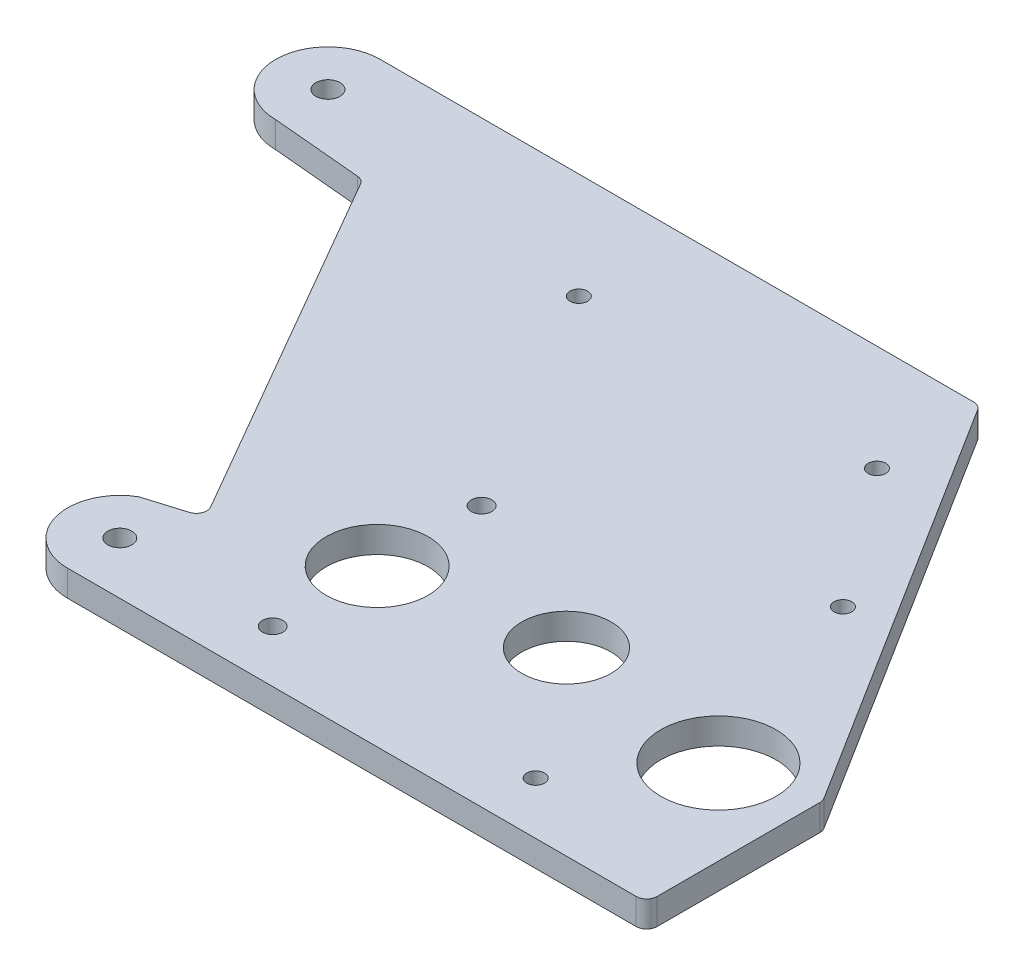
ISO-10303-21;
HEADER;
FILE_DESCRIPTION(('STEP AP214'),'2;1');
FILE_NAME('part.step','',(''),(''),'','','');
FILE_SCHEMA(('AUTOMOTIVE_DESIGN { 1 0 10303 214 1 1 1 1 }'));
ENDSEC;
DATA;
#1=APPLICATION_CONTEXT('core data for automotive mechanical design processes');
#2=APPLICATION_PROTOCOL_DEFINITION('international standard','automotive_design',2000,#1);
#3=PRODUCT_CONTEXT('',#1,'mechanical');
#4=PRODUCT('Part','Part','',(#3));
#5=PRODUCT_RELATED_PRODUCT_CATEGORY('part','',(#4));
#6=PRODUCT_DEFINITION_FORMATION('','',#4);
#7=PRODUCT_DEFINITION_CONTEXT('part definition',#1,'design');
#8=PRODUCT_DEFINITION('design','',#6,#7);
#9=PRODUCT_DEFINITION_SHAPE('','',#8);
#10=(LENGTH_UNIT() NAMED_UNIT(*) SI_UNIT(.MILLI.,.METRE.));
#11=(NAMED_UNIT(*) PLANE_ANGLE_UNIT() SI_UNIT($,.RADIAN.));
#12=(NAMED_UNIT(*) SI_UNIT($,.STERADIAN.) SOLID_ANGLE_UNIT());
#13=UNCERTAINTY_MEASURE_WITH_UNIT(LENGTH_MEASURE(1.E-05),#10,'distance_accuracy_value','');
#14=(GEOMETRIC_REPRESENTATION_CONTEXT(3) GLOBAL_UNCERTAINTY_ASSIGNED_CONTEXT((#13)) GLOBAL_UNIT_ASSIGNED_CONTEXT((#10,
#11,#12)) REPRESENTATION_CONTEXT('',''));
#15=CARTESIAN_POINT('',(0.,0.,0.));
#16=DIRECTION('',(0.,0.,1.));
#17=DIRECTION('',(1.,0.,0.));
#18=AXIS2_PLACEMENT_3D('',#15,#16,#17);
#19=CARTESIAN_POINT('',(4.63150989898809,6.35,15.2100282546713));
#20=DIRECTION('',(-0.291298086746579,0.,-0.956632335151694));
#21=DIRECTION('',(-0.956632335151694,0.,0.291298086746579));
#22=AXIS2_PLACEMENT_3D('',#19,#20,#21);
#23=PLANE('',#22);
#24=DIRECTION('',(0.956632335151694,0.,-0.291298086746579));
#25=VECTOR('',#24,1.);
#26=CARTESIAN_POINT('',(4.63150989898809,6.35,15.2100282546713));
#27=LINE('',#26,#25);
#28=CARTESIAN_POINT('',(-105.982617669633,6.35,48.8924395049369));
#29=VERTEX_POINT('',#28);
#30=CARTESIAN_POINT('',(-96.5688292217659,6.35,46.0259060801956));
#31=VERTEX_POINT('',#30);
#32=EDGE_CURVE('E199',#29,#31,#27,.T.);
#33=ORIENTED_EDGE('',*,*,#32,.T.);
#34=DIRECTION('',(0.,-1.,0.));
#35=VECTOR('',#34,1.);
#36=CARTESIAN_POINT('',(-96.5688292217659,6.35,46.0259060801956));
#37=LINE('',#36,#35);
#38=CARTESIAN_POINT('',(-96.5688292217659,0.,46.0259060801956));
#39=VERTEX_POINT('',#38);
#40=EDGE_CURVE('E308',#31,#39,#37,.T.);
#41=ORIENTED_EDGE('',*,*,#40,.T.);
#42=DIRECTION('',(0.956632335151694,0.,-0.291298086746579));
#43=VECTOR('',#42,1.);
#44=CARTESIAN_POINT('',(4.63150989898809,0.,15.2100282546713));
#45=LINE('',#44,#43);
#46=CARTESIAN_POINT('',(-105.982617669633,0.,48.8924395049369));
#47=VERTEX_POINT('',#46);
#48=EDGE_CURVE('E202',#47,#39,#45,.T.);
#49=ORIENTED_EDGE('',*,*,#48,.F.);
#50=DIRECTION('',(0.,-1.,0.));
#51=VECTOR('',#50,1.);
#52=CARTESIAN_POINT('',(-105.982617669633,6.35,48.8924395049369));
#53=LINE('',#52,#51);
#54=EDGE_CURVE('E195',#29,#47,#53,.T.);
#55=ORIENTED_EDGE('',*,*,#54,.F.);
#56=EDGE_LOOP('',(#33,#41,#49,#55));
#57=FACE_BOUND('',#56,.T.);
#58=ADVANCED_FACE('F91',(#57),#23,.T.);
#59=CARTESIAN_POINT('',(-99.6326176696326,6.35,59.8909621329995));
#60=DIRECTION('',(0.,-1.,0.));
#61=DIRECTION('',(0.,0.,-1.));
#62=AXIS2_PLACEMENT_3D('',#59,#60,#61);
#63=CYLINDRICAL_SURFACE('',#62,12.6999999999998);
#64=CARTESIAN_POINT('',(-99.6326176696326,0.,59.8909621329995));
#65=DIRECTION('',(0.,1.,0.));
#66=DIRECTION('',(0.,0.,1.));
#67=AXIS2_PLACEMENT_3D('',#64,#65,#66);
#68=CIRCLE('',#67,12.6999999999998);
#69=CARTESIAN_POINT('',(-99.6326176696326,0.,72.5909621329996));
#70=VERTEX_POINT('',#69);
#71=EDGE_CURVE('E264',#47,#70,#68,.T.);
#72=ORIENTED_EDGE('',*,*,#71,.T.);
#73=DIRECTION('',(0.,-1.,0.));
#74=VECTOR('',#73,1.);
#75=CARTESIAN_POINT('',(-99.6326176696326,6.35,72.5909621329996));
#76=LINE('',#75,#74);
#77=CARTESIAN_POINT('',(-99.6326176696326,6.35,72.5909621329996));
#78=VERTEX_POINT('',#77);
#79=EDGE_CURVE('E207',#78,#70,#76,.T.);
#80=ORIENTED_EDGE('',*,*,#79,.F.);
#81=CARTESIAN_POINT('',(-99.6326176696326,6.35,59.8909621329995));
#82=DIRECTION('',(0.,1.,0.));
#83=DIRECTION('',(0.,0.,1.));
#84=AXIS2_PLACEMENT_3D('',#81,#82,#83);
#85=CIRCLE('',#84,12.6999999999998);
#86=EDGE_CURVE('E211',#29,#78,#85,.T.);
#87=ORIENTED_EDGE('',*,*,#86,.F.);
#88=ORIENTED_EDGE('',*,*,#54,.T.);
#89=EDGE_LOOP('',(#72,#80,#87,#88));
#90=FACE_BOUND('',#89,.T.);
#91=ADVANCED_FACE('F212',(#90),#63,.T.);
#92=CARTESIAN_POINT('',(0.,6.35,72.590962133));
#93=DIRECTION('',(0.,0.,-1.));
#94=DIRECTION('',(-1.,0.,0.));
#95=AXIS2_PLACEMENT_3D('',#92,#93,#94);
#96=PLANE('',#95);
#97=DIRECTION('',(1.,0.,0.));
#98=VECTOR('',#97,1.);
#99=CARTESIAN_POINT('',(0.,0.,72.590962133));
#100=LINE('',#99,#98);
#101=CARTESIAN_POINT('',(38.6744535100556,0.,72.590962133));
#102=VERTEX_POINT('',#101);
#103=EDGE_CURVE('E266',#70,#102,#100,.T.);
#104=ORIENTED_EDGE('',*,*,#103,.T.);
#105=DIRECTION('',(0.,1.,0.));
#106=VECTOR('',#105,1.);
#107=CARTESIAN_POINT('',(38.6744535100556,6.35,72.590962133));
#108=LINE('',#107,#106);
#109=CARTESIAN_POINT('',(38.6744535100556,6.35,72.590962133));
#110=VERTEX_POINT('',#109);
#111=EDGE_CURVE('E310',#102,#110,#108,.T.);
#112=ORIENTED_EDGE('',*,*,#111,.T.);
#113=DIRECTION('',(1.,0.,0.));
#114=VECTOR('',#113,1.);
#115=CARTESIAN_POINT('',(0.,6.35,72.590962133));
#116=LINE('',#115,#114);
#117=EDGE_CURVE('E216',#78,#110,#116,.T.);
#118=ORIENTED_EDGE('',*,*,#117,.F.);
#119=ORIENTED_EDGE('',*,*,#79,.T.);
#120=EDGE_LOOP('',(#104,#112,#118,#119));
#121=FACE_BOUND('',#120,.T.);
#122=ADVANCED_FACE('F369',(#121),#96,.F.);
#123=CARTESIAN_POINT('',(0.,6.35,-72.590962133));
#124=DIRECTION('',(0.,0.,-1.));
#125=DIRECTION('',(-1.,0.,0.));
#126=AXIS2_PLACEMENT_3D('',#123,#124,#125);
#127=PLANE('',#126);
#128=DIRECTION('',(1.,0.,0.));
#129=VECTOR('',#128,1.);
#130=CARTESIAN_POINT('',(0.,6.35,-72.590962133));
#131=LINE('',#130,#129);
#132=CARTESIAN_POINT('',(-168.788743888658,6.35,-72.5909621329999));
#133=VERTEX_POINT('',#132);
#134=CARTESIAN_POINT('',(-24.439230150475,6.35,-72.590962133));
#135=VERTEX_POINT('',#134);
#136=EDGE_CURVE('E230',#133,#135,#131,.T.);
#137=ORIENTED_EDGE('',*,*,#136,.T.);
#138=DIRECTION('',(0.,1.,0.));
#139=VECTOR('',#138,1.);
#140=CARTESIAN_POINT('',(-24.439230150475,0.,-72.590962133));
#141=LINE('',#140,#139);
#142=CARTESIAN_POINT('',(-24.439230150475,0.,-72.590962133));
#143=VERTEX_POINT('',#142);
#144=EDGE_CURVE('E106',#135,#143,#141,.F.);
#145=ORIENTED_EDGE('',*,*,#144,.T.);
#146=DIRECTION('',(1.,0.,0.));
#147=VECTOR('',#146,1.);
#148=CARTESIAN_POINT('',(0.,0.,-72.590962133));
#149=LINE('',#148,#147);
#150=CARTESIAN_POINT('',(-168.788743888658,0.,-72.5909621329999));
#151=VERTEX_POINT('',#150);
#152=EDGE_CURVE('E269',#151,#143,#149,.T.);
#153=ORIENTED_EDGE('',*,*,#152,.F.);
#154=DIRECTION('',(0.,-1.,0.));
#155=VECTOR('',#154,1.);
#156=CARTESIAN_POINT('',(-168.788743888658,6.35,-72.5909621329999));
#157=LINE('',#156,#155);
#158=EDGE_CURVE('E299',#133,#151,#157,.T.);
#159=ORIENTED_EDGE('',*,*,#158,.F.);
#160=EDGE_LOOP('',(#137,#145,#153,#159));
#161=FACE_BOUND('',#160,.T.);
#162=ADVANCED_FACE('F430',(#161),#127,.T.);
#163=CARTESIAN_POINT('',(-168.788743888658,6.35,-59.890962133));
#164=DIRECTION('',(0.,-1.,0.));
#165=DIRECTION('',(0.,0.,-1.));
#166=AXIS2_PLACEMENT_3D('',#163,#164,#165);
#167=CYLINDRICAL_SURFACE('',#166,12.6999999999998);
#168=CARTESIAN_POINT('',(-168.788743888658,0.,-59.890962133));
#169=DIRECTION('',(0.,1.,0.));
#170=DIRECTION('',(0.,0.,1.));
#171=AXIS2_PLACEMENT_3D('',#168,#169,#170);
#172=CIRCLE('',#171,12.6999999999998);
#173=CARTESIAN_POINT('',(-168.788743865942,0.,-47.1909621330002));
#174=VERTEX_POINT('',#173);
#175=EDGE_CURVE('E271',#151,#174,#172,.T.);
#176=ORIENTED_EDGE('',*,*,#175,.T.);
#177=DIRECTION('',(0.,-1.,0.));
#178=VECTOR('',#177,1.);
#179=CARTESIAN_POINT('',(-168.788743865942,6.35,-47.1909621330002));
#180=LINE('',#179,#178);
#181=CARTESIAN_POINT('',(-168.788743865942,6.35,-47.1909621330002));
#182=VERTEX_POINT('',#181);
#183=EDGE_CURVE('E258',#182,#174,#180,.T.);
#184=ORIENTED_EDGE('',*,*,#183,.F.);
#185=CARTESIAN_POINT('',(-168.788743888658,6.35,-59.890962133));
#186=DIRECTION('',(0.,1.,0.));
#187=DIRECTION('',(0.,0.,1.));
#188=AXIS2_PLACEMENT_3D('',#185,#186,#187);
#189=CIRCLE('',#188,12.6999999999998);
#190=EDGE_CURVE('E232',#133,#182,#189,.T.);
#191=ORIENTED_EDGE('',*,*,#190,.F.);
#192=ORIENTED_EDGE('',*,*,#158,.T.);
#193=EDGE_LOOP('',(#176,#184,#191,#192));
#194=FACE_BOUND('',#193,.T.);
#195=ADVANCED_FACE('F426',(#194),#167,.T.);
#196=CARTESIAN_POINT('',(2.86216329422664,6.35,-31.6858333990644));
#197=DIRECTION('',(0.0899631534478357,0.,-0.995945094381071));
#198=DIRECTION('',(-0.995945094381071,0.,-0.0899631534478357));
#199=AXIS2_PLACEMENT_3D('',#196,#197,#198);
#200=PLANE('',#199);
#201=DIRECTION('',(0.995945094381071,0.,0.0899631534478357));
#202=VECTOR('',#201,1.);
#203=CARTESIAN_POINT('',(2.86216329422664,0.,-31.6858333990644));
#204=LINE('',#203,#202);
#205=CARTESIAN_POINT('',(-146.893746505368,0.,-45.2131994848361));
#206=VERTEX_POINT('',#205);
#207=EDGE_CURVE('E274',#174,#206,#204,.T.);
#208=ORIENTED_EDGE('',*,*,#207,.T.);
#209=DIRECTION('',(0.,-1.,0.));
#210=VECTOR('',#209,1.);
#211=CARTESIAN_POINT('',(-146.893746505368,6.35,-45.2131994848361));
#212=LINE('',#211,#210);
#213=CARTESIAN_POINT('',(-146.893746505368,6.35,-45.2131994848361));
#214=VERTEX_POINT('',#213);
#215=EDGE_CURVE('E306',#206,#214,#212,.F.);
#216=ORIENTED_EDGE('',*,*,#215,.T.);
#217=DIRECTION('',(0.995945094381071,0.,0.0899631534478357));
#218=VECTOR('',#217,1.);
#219=CARTESIAN_POINT('',(2.86216329422664,6.35,-31.6858333990644));
#220=LINE('',#219,#218);
#221=EDGE_CURVE('E235',#182,#214,#220,.T.);
#222=ORIENTED_EDGE('',*,*,#221,.F.);
#223=ORIENTED_EDGE('',*,*,#183,.T.);
#224=EDGE_LOOP('',(#208,#216,#222,#223));
#225=FACE_BOUND('',#224,.T.);
#226=ADVANCED_FACE('F408',(#225),#200,.F.);
#227=CARTESIAN_POINT('',(-168.788743888658,6.35,-59.890962133));
#228=DIRECTION('',(0.,-1.,0.));
#229=DIRECTION('',(0.,0.,-1.));
#230=AXIS2_PLACEMENT_3D('',#227,#228,#229);
#231=CYLINDRICAL_SURFACE('',#230,2.92100000000008);
#232=CARTESIAN_POINT('',(-168.788743888658,6.35,-59.890962133));
#233=DIRECTION('',(0.,1.,0.));
#234=DIRECTION('',(0.,0.,1.));
#235=AXIS2_PLACEMENT_3D('',#232,#233,#234);
#236=CIRCLE('',#235,2.92100000000008);
#237=CARTESIAN_POINT('',(-168.788743888658,6.35,-56.9699621329999));
#238=VERTEX_POINT('',#237);
#239=EDGE_CURVE('E252',#238,#238,#236,.T.);
#240=ORIENTED_EDGE('',*,*,#239,.T.);
#241=EDGE_LOOP('',(#240));
#242=FACE_BOUND('',#241,.T.);
#243=CARTESIAN_POINT('',(-168.788743888658,0.,-59.890962133));
#244=DIRECTION('',(0.,1.,0.));
#245=DIRECTION('',(0.,0.,1.));
#246=AXIS2_PLACEMENT_3D('',#243,#244,#245);
#247=CIRCLE('',#246,2.92100000000008);
#248=CARTESIAN_POINT('',(-168.788743888658,0.,-56.9699621329999));
#249=VERTEX_POINT('',#248);
#250=EDGE_CURVE('E292',#249,#249,#247,.T.);
#251=ORIENTED_EDGE('',*,*,#250,.F.);
#252=EDGE_LOOP('',(#251));
#253=FACE_BOUND('',#252,.T.);
#254=ADVANCED_FACE('F404',(#242,#253),#231,.F.);
#255=CARTESIAN_POINT('',(-62.4429464899444,6.35,34.490962133));
#256=DIRECTION('',(0.,-1.,0.));
#257=DIRECTION('',(0.,0.,-1.));
#258=AXIS2_PLACEMENT_3D('',#255,#256,#257);
#259=CYLINDRICAL_SURFACE('',#258,12.3825);
#260=CARTESIAN_POINT('',(-62.4429464899444,6.35,34.490962133));
#261=DIRECTION('',(0.,1.,0.));
#262=DIRECTION('',(0.,0.,1.));
#263=AXIS2_PLACEMENT_3D('',#260,#261,#262);
#264=CIRCLE('',#263,12.3825);
#265=CARTESIAN_POINT('',(-62.4429464899444,6.35,46.873462133));
#266=VERTEX_POINT('',#265);
#267=EDGE_CURVE('E249',#266,#266,#264,.T.);
#268=ORIENTED_EDGE('',*,*,#267,.T.);
#269=EDGE_LOOP('',(#268));
#270=FACE_BOUND('',#269,.T.);
#271=CARTESIAN_POINT('',(-62.4429464899444,0.,34.490962133));
#272=DIRECTION('',(0.,1.,0.));
#273=DIRECTION('',(0.,0.,1.));
#274=AXIS2_PLACEMENT_3D('',#271,#272,#273);
#275=CIRCLE('',#274,12.3825);
#276=CARTESIAN_POINT('',(-62.4429464899444,0.,46.873462133));
#277=VERTEX_POINT('',#276);
#278=EDGE_CURVE('E289',#277,#277,#275,.T.);
#279=ORIENTED_EDGE('',*,*,#278,.F.);
#280=EDGE_LOOP('',(#279));
#281=FACE_BOUND('',#280,.T.);
#282=ADVANCED_FACE('F407',(#270,#281),#259,.F.);
#283=CARTESIAN_POINT('',(-62.4429464899444,6.35,9.09096213299999));
#284=DIRECTION('',(0.,-1.,0.));
#285=DIRECTION('',(0.,0.,-1.));
#286=AXIS2_PLACEMENT_3D('',#283,#284,#285);
#287=CYLINDRICAL_SURFACE('',#286,2.4892);
#288=CARTESIAN_POINT('',(-62.4429464899444,6.35,9.09096213299999));
#289=DIRECTION('',(0.,1.,0.));
#290=DIRECTION('',(0.,0.,1.));
#291=AXIS2_PLACEMENT_3D('',#288,#289,#290);
#292=CIRCLE('',#291,2.4892);
#293=CARTESIAN_POINT('',(-62.4429464899444,6.35,11.580162133));
#294=VERTEX_POINT('',#293);
#295=EDGE_CURVE('E246',#294,#294,#292,.T.);
#296=ORIENTED_EDGE('',*,*,#295,.T.);
#297=EDGE_LOOP('',(#296));
#298=FACE_BOUND('',#297,.T.);
#299=CARTESIAN_POINT('',(-62.4429464899444,0.,9.09096213299999));
#300=DIRECTION('',(0.,1.,0.));
#301=DIRECTION('',(0.,0.,1.));
#302=AXIS2_PLACEMENT_3D('',#299,#300,#301);
#303=CIRCLE('',#302,2.4892);
#304=CARTESIAN_POINT('',(-62.4429464899444,0.,11.580162133));
#305=VERTEX_POINT('',#304);
#306=EDGE_CURVE('E286',#305,#305,#303,.T.);
#307=ORIENTED_EDGE('',*,*,#306,.F.);
#308=EDGE_LOOP('',(#307));
#309=FACE_BOUND('',#308,.T.);
#310=ADVANCED_FACE('F412',(#298,#309),#287,.F.);
#311=CARTESIAN_POINT('',(-62.4429464899444,6.35,59.890962133));
#312=DIRECTION('',(0.,-1.,0.));
#313=DIRECTION('',(0.,0.,-1.));
#314=AXIS2_PLACEMENT_3D('',#311,#312,#313);
#315=CYLINDRICAL_SURFACE('',#314,2.4892);
#316=CARTESIAN_POINT('',(-62.4429464899444,6.35,59.890962133));
#317=DIRECTION('',(0.,1.,0.));
#318=DIRECTION('',(0.,0.,1.));
#319=AXIS2_PLACEMENT_3D('',#316,#317,#318);
#320=CIRCLE('',#319,2.4892);
#321=CARTESIAN_POINT('',(-62.4429464899444,6.35,62.380162133));
#322=VERTEX_POINT('',#321);
#323=EDGE_CURVE('E243',#322,#322,#320,.T.);
#324=ORIENTED_EDGE('',*,*,#323,.T.);
#325=EDGE_LOOP('',(#324));
#326=FACE_BOUND('',#325,.T.);
#327=CARTESIAN_POINT('',(-62.4429464899444,0.,59.890962133));
#328=DIRECTION('',(0.,1.,0.));
#329=DIRECTION('',(0.,0.,1.));
#330=AXIS2_PLACEMENT_3D('',#327,#328,#329);
#331=CIRCLE('',#330,2.4892);
#332=CARTESIAN_POINT('',(-62.4429464899444,0.,62.380162133));
#333=VERTEX_POINT('',#332);
#334=EDGE_CURVE('E283',#333,#333,#331,.T.);
#335=ORIENTED_EDGE('',*,*,#334,.F.);
#336=EDGE_LOOP('',(#335));
#337=FACE_BOUND('',#336,.T.);
#338=ADVANCED_FACE('F416',(#326,#337),#315,.F.);
#339=CARTESIAN_POINT('',(20.5642535100556,6.35,34.490962133));
#340=DIRECTION('',(0.,-1.,0.));
#341=DIRECTION('',(0.,0.,-1.));
#342=AXIS2_PLACEMENT_3D('',#339,#340,#341);
#343=CYLINDRICAL_SURFACE('',#342,14.0335);
#344=CARTESIAN_POINT('',(20.5642535100556,6.35,34.490962133));
#345=DIRECTION('',(0.,1.,0.));
#346=DIRECTION('',(0.,0.,1.));
#347=AXIS2_PLACEMENT_3D('',#344,#345,#346);
#348=CIRCLE('',#347,14.0335);
#349=CARTESIAN_POINT('',(20.5642535100556,6.35,48.524462133));
#350=VERTEX_POINT('',#349);
#351=EDGE_CURVE('E240',#350,#350,#348,.T.);
#352=ORIENTED_EDGE('',*,*,#351,.T.);
#353=EDGE_LOOP('',(#352));
#354=FACE_BOUND('',#353,.T.);
#355=CARTESIAN_POINT('',(20.5642535100556,0.,34.490962133));
#356=DIRECTION('',(0.,1.,0.));
#357=DIRECTION('',(0.,0.,1.));
#358=AXIS2_PLACEMENT_3D('',#355,#356,#357);
#359=CIRCLE('',#358,14.0335);
#360=CARTESIAN_POINT('',(20.5642535100556,0.,48.524462133));
#361=VERTEX_POINT('',#360);
#362=EDGE_CURVE('E280',#361,#361,#359,.T.);
#363=ORIENTED_EDGE('',*,*,#362,.F.);
#364=EDGE_LOOP('',(#363));
#365=FACE_BOUND('',#364,.T.);
#366=ADVANCED_FACE('F383',(#354,#365),#343,.F.);
#367=CARTESIAN_POINT('',(-89.6594879562971,6.35,51.7649295069719));
#368=DIRECTION('',(0.86602540378444,0.,-0.499999999999998));
#369=DIRECTION('',(-0.499999999999998,0.,-0.86602540378444));
#370=AXIS2_PLACEMENT_3D('',#367,#368,#369);
#371=PLANE('',#370);
#372=DIRECTION('',(0.499999999999998,0.,0.86602540378444));
#373=VECTOR('',#372,1.);
#374=CARTESIAN_POINT('',(-89.6594879562971,6.35,51.7649295069719));
#375=LINE('',#374,#373);
#376=CARTESIAN_POINT('',(-144.922548389513,6.35,-43.9534989451082));
#377=VERTEX_POINT('',#376);
#378=CARTESIAN_POINT('',(-95.1090218364897,6.35,42.3260599489103));
#379=VERTEX_POINT('',#378);
#380=EDGE_CURVE('E238',#377,#379,#375,.T.);
#381=ORIENTED_EDGE('',*,*,#380,.F.);
#382=DIRECTION('',(0.,-1.,0.));
#383=VECTOR('',#382,1.);
#384=CARTESIAN_POINT('',(-144.922548389513,0.,-43.9534989451082));
#385=LINE('',#384,#383);
#386=CARTESIAN_POINT('',(-144.922548389513,0.,-43.9534989451082));
#387=VERTEX_POINT('',#386);
#388=EDGE_CURVE('E303',#377,#387,#385,.T.);
#389=ORIENTED_EDGE('',*,*,#388,.T.);
#390=DIRECTION('',(0.499999999999998,0.,0.86602540378444));
#391=VECTOR('',#390,1.);
#392=CARTESIAN_POINT('',(-89.6594879562971,0.,51.7649295069719));
#393=LINE('',#392,#391);
#394=CARTESIAN_POINT('',(-95.1090218364897,0.,42.3260599489103));
#395=VERTEX_POINT('',#394);
#396=EDGE_CURVE('E277',#387,#395,#393,.T.);
#397=ORIENTED_EDGE('',*,*,#396,.T.);
#398=DIRECTION('',(0.,-1.,0.));
#399=VECTOR('',#398,1.);
#400=CARTESIAN_POINT('',(-95.1090218364897,6.35,42.3260599489103));
#401=LINE('',#400,#399);
#402=EDGE_CURVE('E206',#395,#379,#401,.F.);
#403=ORIENTED_EDGE('',*,*,#402,.T.);
#404=EDGE_LOOP('',(#381,#389,#397,#403));
#405=FACE_BOUND('',#404,.T.);
#406=ADVANCED_FACE('F347',(#405),#371,.F.);
#407=CARTESIAN_POINT('',(-22.2217822304585,6.35,28.6713791916327));
#408=DIRECTION('',(0.,-1.,0.));
#409=DIRECTION('',(0.,0.,-1.));
#410=AXIS2_PLACEMENT_3D('',#407,#408,#409);
#411=CYLINDRICAL_SURFACE('',#410,10.8585);
#412=CARTESIAN_POINT('',(-22.2217822304585,6.35,28.6713791916327));
#413=DIRECTION('',(0.,1.,0.));
#414=DIRECTION('',(0.,0.,1.));
#415=AXIS2_PLACEMENT_3D('',#412,#413,#414);
#416=CIRCLE('',#415,10.8585);
#417=CARTESIAN_POINT('',(-22.2217822304585,6.35,39.5298791916327));
#418=VERTEX_POINT('',#417);
#419=EDGE_CURVE('E222',#418,#418,#416,.T.);
#420=ORIENTED_EDGE('',*,*,#419,.T.);
#421=EDGE_LOOP('',(#420));
#422=FACE_BOUND('',#421,.T.);
#423=CARTESIAN_POINT('',(-22.2217822304585,0.,28.6713791916327));
#424=DIRECTION('',(0.,1.,0.));
#425=DIRECTION('',(0.,0.,1.));
#426=AXIS2_PLACEMENT_3D('',#423,#424,#425);
#427=CIRCLE('',#426,10.8585);
#428=CARTESIAN_POINT('',(-22.2217822304585,0.,39.5298791916327));
#429=VERTEX_POINT('',#428);
#430=EDGE_CURVE('E259',#429,#429,#427,.T.);
#431=ORIENTED_EDGE('',*,*,#430,.F.);
#432=EDGE_LOOP('',(#431));
#433=FACE_BOUND('',#432,.T.);
#434=ADVANCED_FACE('F373',(#422,#433),#411,.F.);
#435=CARTESIAN_POINT('',(-99.6326176696326,6.35,59.8909621329995));
#436=DIRECTION('',(0.,-1.,0.));
#437=DIRECTION('',(0.,0.,-1.));
#438=AXIS2_PLACEMENT_3D('',#435,#436,#437);
#439=CYLINDRICAL_SURFACE('',#438,2.92100000000006);
#440=CARTESIAN_POINT('',(-99.6326176696326,6.35,59.8909621329995));
#441=DIRECTION('',(0.,1.,0.));
#442=DIRECTION('',(0.,0.,1.));
#443=AXIS2_PLACEMENT_3D('',#440,#441,#442);
#444=CIRCLE('',#443,2.92100000000006);
#445=CARTESIAN_POINT('',(-99.6326176696326,6.35,62.8119621329996));
#446=VERTEX_POINT('',#445);
#447=EDGE_CURVE('E255',#446,#446,#444,.T.);
#448=ORIENTED_EDGE('',*,*,#447,.T.);
#449=EDGE_LOOP('',(#448));
#450=FACE_BOUND('',#449,.T.);
#451=CARTESIAN_POINT('',(-99.6326176696326,0.,59.8909621329995));
#452=DIRECTION('',(0.,1.,0.));
#453=DIRECTION('',(0.,0.,1.));
#454=AXIS2_PLACEMENT_3D('',#451,#452,#453);
#455=CIRCLE('',#454,2.92100000000006);
#456=CARTESIAN_POINT('',(-99.6326176696326,0.,62.8119621329996));
#457=VERTEX_POINT('',#456);
#458=EDGE_CURVE('E225',#457,#457,#455,.T.);
#459=ORIENTED_EDGE('',*,*,#458,.F.);
#460=EDGE_LOOP('',(#459));
#461=FACE_BOUND('',#460,.T.);
#462=ADVANCED_FACE('F375',(#450,#461),#439,.F.);
#463=CARTESIAN_POINT('',(0.,6.35,0.));
#464=DIRECTION('',(0.,1.,0.));
#465=DIRECTION('',(0.,0.,1.));
#466=AXIS2_PLACEMENT_3D('',#463,#464,#465);
#467=PLANE('',#466);
#468=ORIENTED_EDGE('',*,*,#117,.T.);
#469=CARTESIAN_POINT('',(38.6744535100556,6.35,70.050962133));
#470=DIRECTION('',(0.,1.,0.));
#471=DIRECTION('',(0.,0.,1.));
#472=AXIS2_PLACEMENT_3D('',#469,#470,#471);
#473=CIRCLE('',#472,2.54);
#474=CARTESIAN_POINT('',(41.2144535100556,6.35,70.050962133));
#475=VERTEX_POINT('',#474);
#476=EDGE_CURVE('E317',#110,#475,#473,.T.);
#477=ORIENTED_EDGE('',*,*,#476,.T.);
#478=DIRECTION('',(0.,0.,1.));
#479=VECTOR('',#478,1.);
#480=CARTESIAN_POINT('',(41.2144535100556,6.35,0.));
#481=LINE('',#480,#479);
#482=CARTESIAN_POINT('',(41.2144535100556,6.35,30.435098213011));
#483=VERTEX_POINT('',#482);
#484=EDGE_CURVE('E442',#483,#475,#481,.T.);
#485=ORIENTED_EDGE('',*,*,#484,.F.);
#486=CARTESIAN_POINT('',(38.6744535100556,6.35,30.435098213011));
#487=DIRECTION('',(0.,1.,0.));
#488=DIRECTION('',(0.,0.,1.));
#489=AXIS2_PLACEMENT_3D('',#486,#487,#488);
#490=CIRCLE('',#489,2.54);
#491=CARTESIAN_POINT('',(40.8253826170263,6.35,29.0841341214134));
#492=VERTEX_POINT('',#491);
#493=EDGE_CURVE('E315',#483,#492,#490,.T.);
#494=ORIENTED_EDGE('',*,*,#493,.T.);
#495=DIRECTION('',(0.531875626613249,0.,0.846822483059327));
#496=VECTOR('',#495,1.);
#497=CARTESIAN_POINT('',(16.1766041623133,6.35,-10.1602657551336));
#498=LINE('',#497,#496);
#499=CARTESIAN_POINT('',(-22.2883010435043,6.35,-71.4019262245977));
#500=VERTEX_POINT('',#499);
#501=EDGE_CURVE('E448',#500,#492,#498,.T.);
#502=ORIENTED_EDGE('',*,*,#501,.F.);
#503=CARTESIAN_POINT('',(-24.439230150475,6.35,-70.050962133));
#504=DIRECTION('',(0.,1.,0.));
#505=DIRECTION('',(0.,0.,1.));
#506=AXIS2_PLACEMENT_3D('',#503,#504,#505);
#507=CIRCLE('',#506,2.54);
#508=EDGE_CURVE('E313',#500,#135,#507,.T.);
#509=ORIENTED_EDGE('',*,*,#508,.T.);
#510=ORIENTED_EDGE('',*,*,#136,.F.);
#511=ORIENTED_EDGE('',*,*,#190,.T.);
#512=ORIENTED_EDGE('',*,*,#221,.T.);
#513=CARTESIAN_POINT('',(-147.122252915126,6.35,-42.6834989451082));
#514=DIRECTION('',(0.,1.,0.));
#515=DIRECTION('',(0.,0.,1.));
#516=AXIS2_PLACEMENT_3D('',#513,#514,#515);
#517=CIRCLE('',#516,2.54);
#518=EDGE_CURVE('E337',#214,#377,#517,.F.);
#519=ORIENTED_EDGE('',*,*,#518,.T.);
#520=ORIENTED_EDGE('',*,*,#380,.T.);
#521=CARTESIAN_POINT('',(-97.3087263621022,6.35,43.5960599489103));
#522=DIRECTION('',(0.,1.,0.));
#523=DIRECTION('',(0.,0.,1.));
#524=AXIS2_PLACEMENT_3D('',#521,#522,#523);
#525=CIRCLE('',#524,2.54);
#526=EDGE_CURVE('E12',#379,#31,#525,.F.);
#527=ORIENTED_EDGE('',*,*,#526,.T.);
#528=ORIENTED_EDGE('',*,*,#32,.F.);
#529=ORIENTED_EDGE('',*,*,#86,.T.);
#530=EDGE_LOOP('',(#468,#477,#485,#494,#502,#509,#510,#511,#512,#519,#520,#527,#528,#529));
#531=FACE_BOUND('',#530,.T.);
#532=CARTESIAN_POINT('',(1.51425351005562,6.35,59.8909621329996));
#533=DIRECTION('',(0.,1.,0.));
#534=DIRECTION('',(0.,0.,1.));
#535=AXIS2_PLACEMENT_3D('',#532,#533,#534);
#536=CIRCLE('',#535,2.15265);
#537=CARTESIAN_POINT('',(1.51425351005562,6.35,62.0436121329996));
#538=VERTEX_POINT('',#537);
#539=EDGE_CURVE('E458',#538,#538,#536,.T.);
#540=ORIENTED_EDGE('',*,*,#539,.F.);
#541=EDGE_LOOP('',(#540));
#542=FACE_BOUND('',#541,.T.);
#543=CARTESIAN_POINT('',(2.80007717064274,6.35,-13.5492982875591));
#544=DIRECTION('',(0.,1.,0.));
#545=DIRECTION('',(0.,0.,1.));
#546=AXIS2_PLACEMENT_3D('',#543,#544,#545);
#547=CIRCLE('',#546,2.15265);
#548=CARTESIAN_POINT('',(2.80007717064274,6.35,-11.3966482875591));
#549=VERTEX_POINT('',#548);
#550=EDGE_CURVE('E457',#549,#549,#547,.T.);
#551=ORIENTED_EDGE('',*,*,#550,.F.);
#552=EDGE_LOOP('',(#551));
#553=FACE_BOUND('',#552,.T.);
#554=CARTESIAN_POINT('',(-22.2217822304585,6.35,-46.848232446844));
#555=DIRECTION('',(0.,1.,0.));
#556=DIRECTION('',(0.,0.,1.));
#557=AXIS2_PLACEMENT_3D('',#554,#555,#556);
#558=CIRCLE('',#557,2.15265);
#559=CARTESIAN_POINT('',(-22.2217822304585,6.35,-44.695582446844));
#560=VERTEX_POINT('',#559);
#561=EDGE_CURVE('E464',#560,#560,#558,.T.);
#562=ORIENTED_EDGE('',*,*,#561,.F.);
#563=EDGE_LOOP('',(#562));
#564=FACE_BOUND('',#563,.T.);
#565=CARTESIAN_POINT('',(-94.739455538868,6.35,-46.848232446844));
#566=DIRECTION('',(0.,1.,0.));
#567=DIRECTION('',(0.,0.,1.));
#568=AXIS2_PLACEMENT_3D('',#565,#566,#567);
#569=CIRCLE('',#568,2.15265000000001);
#570=CARTESIAN_POINT('',(-94.739455538868,6.35,-44.695582446844));
#571=VERTEX_POINT('',#570);
#572=EDGE_CURVE('E470',#571,#571,#569,.T.);
#573=ORIENTED_EDGE('',*,*,#572,.F.);
#574=EDGE_LOOP('',(#573));
#575=FACE_BOUND('',#574,.T.);
#576=ORIENTED_EDGE('',*,*,#419,.F.);
#577=EDGE_LOOP('',(#576));
#578=FACE_BOUND('',#577,.T.);
#579=ORIENTED_EDGE('',*,*,#351,.F.);
#580=EDGE_LOOP('',(#579));
#581=FACE_BOUND('',#580,.T.);
#582=ORIENTED_EDGE('',*,*,#323,.F.);
#583=EDGE_LOOP('',(#582));
#584=FACE_BOUND('',#583,.T.);
#585=ORIENTED_EDGE('',*,*,#295,.F.);
#586=EDGE_LOOP('',(#585));
#587=FACE_BOUND('',#586,.T.);
#588=ORIENTED_EDGE('',*,*,#267,.F.);
#589=EDGE_LOOP('',(#588));
#590=FACE_BOUND('',#589,.T.);
#591=ORIENTED_EDGE('',*,*,#239,.F.);
#592=EDGE_LOOP('',(#591));
#593=FACE_BOUND('',#592,.T.);
#594=ORIENTED_EDGE('',*,*,#447,.F.);
#595=EDGE_LOOP('',(#594));
#596=FACE_BOUND('',#595,.T.);
#597=ADVANCED_FACE('F218',(#531,#542,#553,#564,#575,#578,#581,#584,#587,#590,#593,#596),#467,.T.);
#598=CARTESIAN_POINT('',(0.,0.,0.));
#599=DIRECTION('',(0.,1.,0.));
#600=DIRECTION('',(0.,0.,1.));
#601=AXIS2_PLACEMENT_3D('',#598,#599,#600);
#602=PLANE('',#601);
#603=CARTESIAN_POINT('',(1.51425351005562,0.,59.8909621329996));
#604=DIRECTION('',(0.,1.,0.));
#605=DIRECTION('',(0.,0.,1.));
#606=AXIS2_PLACEMENT_3D('',#603,#604,#605);
#607=CIRCLE('',#606,2.15265);
#608=CARTESIAN_POINT('',(1.51425351005562,0.,62.0436121329996));
#609=VERTEX_POINT('',#608);
#610=EDGE_CURVE('E455',#609,#609,#607,.T.);
#611=ORIENTED_EDGE('',*,*,#610,.T.);
#612=EDGE_LOOP('',(#611));
#613=FACE_BOUND('',#612,.T.);
#614=CARTESIAN_POINT('',(2.80007717064274,0.,-13.5492982875591));
#615=DIRECTION('',(0.,1.,0.));
#616=DIRECTION('',(0.,0.,1.));
#617=AXIS2_PLACEMENT_3D('',#614,#615,#616);
#618=CIRCLE('',#617,2.15265);
#619=CARTESIAN_POINT('',(2.80007717064274,0.,-11.3966482875591));
#620=VERTEX_POINT('',#619);
#621=EDGE_CURVE('E461',#620,#620,#618,.T.);
#622=ORIENTED_EDGE('',*,*,#621,.T.);
#623=EDGE_LOOP('',(#622));
#624=FACE_BOUND('',#623,.T.);
#625=CARTESIAN_POINT('',(-22.2217822304585,0.,-46.848232446844));
#626=DIRECTION('',(0.,1.,0.));
#627=DIRECTION('',(0.,0.,1.));
#628=AXIS2_PLACEMENT_3D('',#625,#626,#627);
#629=CIRCLE('',#628,2.15265);
#630=CARTESIAN_POINT('',(-22.2217822304585,0.,-44.695582446844));
#631=VERTEX_POINT('',#630);
#632=EDGE_CURVE('E467',#631,#631,#629,.T.);
#633=ORIENTED_EDGE('',*,*,#632,.T.);
#634=EDGE_LOOP('',(#633));
#635=FACE_BOUND('',#634,.T.);
#636=CARTESIAN_POINT('',(-94.739455538868,0.,-46.848232446844));
#637=DIRECTION('',(0.,1.,0.));
#638=DIRECTION('',(0.,0.,1.));
#639=AXIS2_PLACEMENT_3D('',#636,#637,#638);
#640=CIRCLE('',#639,2.15265000000001);
#641=CARTESIAN_POINT('',(-94.739455538868,0.,-44.695582446844));
#642=VERTEX_POINT('',#641);
#643=EDGE_CURVE('E262',#642,#642,#640,.T.);
#644=ORIENTED_EDGE('',*,*,#643,.T.);
#645=EDGE_LOOP('',(#644));
#646=FACE_BOUND('',#645,.T.);
#647=ORIENTED_EDGE('',*,*,#430,.T.);
#648=EDGE_LOOP('',(#647));
#649=FACE_BOUND('',#648,.T.);
#650=DIRECTION('',(0.,0.,1.));
#651=VECTOR('',#650,1.);
#652=CARTESIAN_POINT('',(41.2144535100556,0.,0.));
#653=LINE('',#652,#651);
#654=CARTESIAN_POINT('',(41.2144535100556,0.,30.435098213011));
#655=VERTEX_POINT('',#654);
#656=CARTESIAN_POINT('',(41.2144535100556,0.,70.050962133));
#657=VERTEX_POINT('',#656);
#658=EDGE_CURVE('E450',#655,#657,#653,.T.);
#659=ORIENTED_EDGE('',*,*,#658,.T.);
#660=CARTESIAN_POINT('',(38.6744535100556,0.,70.050962133));
#661=DIRECTION('',(0.,1.,0.));
#662=DIRECTION('',(0.,0.,1.));
#663=AXIS2_PLACEMENT_3D('',#660,#661,#662);
#664=CIRCLE('',#663,2.54);
#665=EDGE_CURVE('E328',#657,#102,#664,.F.);
#666=ORIENTED_EDGE('',*,*,#665,.T.);
#667=ORIENTED_EDGE('',*,*,#103,.F.);
#668=ORIENTED_EDGE('',*,*,#71,.F.);
#669=ORIENTED_EDGE('',*,*,#48,.T.);
#670=CARTESIAN_POINT('',(-97.3087263621022,0.,43.5960599489103));
#671=DIRECTION('',(0.,1.,0.));
#672=DIRECTION('',(0.,0.,1.));
#673=AXIS2_PLACEMENT_3D('',#670,#671,#672);
#674=CIRCLE('',#673,2.54);
#675=EDGE_CURVE('E99',#39,#395,#674,.T.);
#676=ORIENTED_EDGE('',*,*,#675,.T.);
#677=ORIENTED_EDGE('',*,*,#396,.F.);
#678=CARTESIAN_POINT('',(-147.122252915126,0.,-42.6834989451082));
#679=DIRECTION('',(0.,1.,0.));
#680=DIRECTION('',(0.,0.,1.));
#681=AXIS2_PLACEMENT_3D('',#678,#679,#680);
#682=CIRCLE('',#681,2.54);
#683=EDGE_CURVE('E335',#387,#206,#682,.T.);
#684=ORIENTED_EDGE('',*,*,#683,.T.);
#685=ORIENTED_EDGE('',*,*,#207,.F.);
#686=ORIENTED_EDGE('',*,*,#175,.F.);
#687=ORIENTED_EDGE('',*,*,#152,.T.);
#688=CARTESIAN_POINT('',(-24.439230150475,0.,-70.050962133));
#689=DIRECTION('',(0.,1.,0.));
#690=DIRECTION('',(0.,0.,1.));
#691=AXIS2_PLACEMENT_3D('',#688,#689,#690);
#692=CIRCLE('',#691,2.54);
#693=CARTESIAN_POINT('',(-22.2883010435043,0.,-71.4019262245977));
#694=VERTEX_POINT('',#693);
#695=EDGE_CURVE('E324',#143,#694,#692,.F.);
#696=ORIENTED_EDGE('',*,*,#695,.T.);
#697=DIRECTION('',(0.531875626613249,0.,0.846822483059327));
#698=VECTOR('',#697,1.);
#699=CARTESIAN_POINT('',(16.1766041623133,0.,-10.1602657551336));
#700=LINE('',#699,#698);
#701=CARTESIAN_POINT('',(40.8253826170263,0.,29.0841341214134));
#702=VERTEX_POINT('',#701);
#703=EDGE_CURVE('E447',#694,#702,#700,.T.);
#704=ORIENTED_EDGE('',*,*,#703,.T.);
#705=CARTESIAN_POINT('',(38.6744535100556,0.,30.435098213011));
#706=DIRECTION('',(0.,1.,0.));
#707=DIRECTION('',(0.,0.,1.));
#708=AXIS2_PLACEMENT_3D('',#705,#706,#707);
#709=CIRCLE('',#708,2.54);
#710=EDGE_CURVE('E326',#702,#655,#709,.F.);
#711=ORIENTED_EDGE('',*,*,#710,.T.);
#712=EDGE_LOOP('',(#659,#666,#667,#668,#669,#676,#677,#684,#685,#686,#687,#696,#704,#711));
#713=FACE_BOUND('',#712,.T.);
#714=ORIENTED_EDGE('',*,*,#362,.T.);
#715=EDGE_LOOP('',(#714));
#716=FACE_BOUND('',#715,.T.);
#717=ORIENTED_EDGE('',*,*,#334,.T.);
#718=EDGE_LOOP('',(#717));
#719=FACE_BOUND('',#718,.T.);
#720=ORIENTED_EDGE('',*,*,#306,.T.);
#721=EDGE_LOOP('',(#720));
#722=FACE_BOUND('',#721,.T.);
#723=ORIENTED_EDGE('',*,*,#278,.T.);
#724=EDGE_LOOP('',(#723));
#725=FACE_BOUND('',#724,.T.);
#726=ORIENTED_EDGE('',*,*,#250,.T.);
#727=EDGE_LOOP('',(#726));
#728=FACE_BOUND('',#727,.T.);
#729=ORIENTED_EDGE('',*,*,#458,.T.);
#730=EDGE_LOOP('',(#729));
#731=FACE_BOUND('',#730,.T.);
#732=ADVANCED_FACE('F341',(#613,#624,#635,#646,#649,#713,#716,#719,#722,#725,#728,#731),#602,.F.);
#733=CARTESIAN_POINT('',(-94.739455538868,0.,-46.848232446844));
#734=DIRECTION('',(0.,1.,0.));
#735=DIRECTION('',(0.,0.,1.));
#736=AXIS2_PLACEMENT_3D('',#733,#734,#735);
#737=CYLINDRICAL_SURFACE('',#736,2.15265000000001);
#738=ORIENTED_EDGE('',*,*,#643,.F.);
#739=EDGE_LOOP('',(#738));
#740=FACE_BOUND('',#739,.T.);
#741=ORIENTED_EDGE('',*,*,#572,.T.);
#742=EDGE_LOOP('',(#741));
#743=FACE_BOUND('',#742,.T.);
#744=ADVANCED_FACE('F390',(#740,#743),#737,.F.);
#745=CARTESIAN_POINT('',(-22.2217822304585,0.,-46.848232446844));
#746=DIRECTION('',(0.,1.,0.));
#747=DIRECTION('',(0.,0.,1.));
#748=AXIS2_PLACEMENT_3D('',#745,#746,#747);
#749=CYLINDRICAL_SURFACE('',#748,2.15265);
#750=ORIENTED_EDGE('',*,*,#632,.F.);
#751=EDGE_LOOP('',(#750));
#752=FACE_BOUND('',#751,.T.);
#753=ORIENTED_EDGE('',*,*,#561,.T.);
#754=EDGE_LOOP('',(#753));
#755=FACE_BOUND('',#754,.T.);
#756=ADVANCED_FACE('F397',(#752,#755),#749,.F.);
#757=CARTESIAN_POINT('',(2.80007717064274,0.,-13.5492982875591));
#758=DIRECTION('',(0.,1.,0.));
#759=DIRECTION('',(0.,0.,1.));
#760=AXIS2_PLACEMENT_3D('',#757,#758,#759);
#761=CYLINDRICAL_SURFACE('',#760,2.15265);
#762=ORIENTED_EDGE('',*,*,#621,.F.);
#763=EDGE_LOOP('',(#762));
#764=FACE_BOUND('',#763,.T.);
#765=ORIENTED_EDGE('',*,*,#550,.T.);
#766=EDGE_LOOP('',(#765));
#767=FACE_BOUND('',#766,.T.);
#768=ADVANCED_FACE('F514',(#764,#767),#761,.F.);
#769=CARTESIAN_POINT('',(1.51425351005562,0.,59.8909621329996));
#770=DIRECTION('',(0.,1.,0.));
#771=DIRECTION('',(0.,0.,1.));
#772=AXIS2_PLACEMENT_3D('',#769,#770,#771);
#773=CYLINDRICAL_SURFACE('',#772,2.15265);
#774=ORIENTED_EDGE('',*,*,#610,.F.);
#775=EDGE_LOOP('',(#774));
#776=FACE_BOUND('',#775,.T.);
#777=ORIENTED_EDGE('',*,*,#539,.T.);
#778=EDGE_LOOP('',(#777));
#779=FACE_BOUND('',#778,.T.);
#780=ADVANCED_FACE('F520',(#776,#779),#773,.F.);
#781=CARTESIAN_POINT('',(41.2144535100556,0.,0.));
#782=DIRECTION('',(-1.,0.,0.));
#783=DIRECTION('',(0.,0.,1.));
#784=AXIS2_PLACEMENT_3D('',#781,#782,#783);
#785=PLANE('',#784);
#786=ORIENTED_EDGE('',*,*,#484,.T.);
#787=DIRECTION('',(0.,1.,0.));
#788=VECTOR('',#787,1.);
#789=CARTESIAN_POINT('',(41.2144535100556,0.,70.050962133));
#790=LINE('',#789,#788);
#791=EDGE_CURVE('E322',#475,#657,#790,.F.);
#792=ORIENTED_EDGE('',*,*,#791,.T.);
#793=ORIENTED_EDGE('',*,*,#658,.F.);
#794=DIRECTION('',(0.,1.,0.));
#795=VECTOR('',#794,1.);
#796=CARTESIAN_POINT('',(41.2144535100556,0.,30.435098213011));
#797=LINE('',#796,#795);
#798=EDGE_CURVE('E319',#655,#483,#797,.T.);
#799=ORIENTED_EDGE('',*,*,#798,.T.);
#800=EDGE_LOOP('',(#786,#792,#793,#799));
#801=FACE_BOUND('',#800,.T.);
#802=ADVANCED_FACE('F444',(#801),#785,.F.);
#803=CARTESIAN_POINT('',(16.1766041623133,0.,-10.1602657551336));
#804=DIRECTION('',(-0.846822483059327,0.,0.531875626613249));
#805=DIRECTION('',(0.531875626613249,0.,0.846822483059327));
#806=AXIS2_PLACEMENT_3D('',#803,#804,#805);
#807=PLANE('',#806);
#808=ORIENTED_EDGE('',*,*,#501,.T.);
#809=DIRECTION('',(0.,1.,0.));
#810=VECTOR('',#809,1.);
#811=CARTESIAN_POINT('',(40.8253826170263,0.,29.0841341214134));
#812=LINE('',#811,#810);
#813=EDGE_CURVE('E114',#492,#702,#812,.F.);
#814=ORIENTED_EDGE('',*,*,#813,.T.);
#815=ORIENTED_EDGE('',*,*,#703,.F.);
#816=DIRECTION('',(0.,1.,0.));
#817=VECTOR('',#816,1.);
#818=CARTESIAN_POINT('',(-22.2883010435043,6.35,-71.4019262245976));
#819=LINE('',#818,#817);
#820=EDGE_CURVE('E330',#694,#500,#819,.T.);
#821=ORIENTED_EDGE('',*,*,#820,.T.);
#822=EDGE_LOOP('',(#808,#814,#815,#821));
#823=FACE_BOUND('',#822,.T.);
#824=ADVANCED_FACE('F361',(#823),#807,.F.);
#825=CARTESIAN_POINT('',(-147.122252915126,6.35,-42.6834989451082));
#826=DIRECTION('',(0.,1.,0.));
#827=DIRECTION('',(0.,0.,1.));
#828=AXIS2_PLACEMENT_3D('',#825,#826,#827);
#829=CYLINDRICAL_SURFACE('',#828,2.54);
#830=ORIENTED_EDGE('',*,*,#518,.F.);
#831=ORIENTED_EDGE('',*,*,#215,.F.);
#832=ORIENTED_EDGE('',*,*,#683,.F.);
#833=ORIENTED_EDGE('',*,*,#388,.F.);
#834=EDGE_LOOP('',(#830,#831,#832,#833));
#835=FACE_BOUND('',#834,.T.);
#836=ADVANCED_FACE('F352',(#835),#829,.F.);
#837=CARTESIAN_POINT('',(-97.3087263621022,6.35,43.5960599489103));
#838=DIRECTION('',(0.,-1.,0.));
#839=DIRECTION('',(0.,0.,-1.));
#840=AXIS2_PLACEMENT_3D('',#837,#838,#839);
#841=CYLINDRICAL_SURFACE('',#840,2.54);
#842=ORIENTED_EDGE('',*,*,#526,.F.);
#843=ORIENTED_EDGE('',*,*,#402,.F.);
#844=ORIENTED_EDGE('',*,*,#675,.F.);
#845=ORIENTED_EDGE('',*,*,#40,.F.);
#846=EDGE_LOOP('',(#842,#843,#844,#845));
#847=FACE_BOUND('',#846,.T.);
#848=ADVANCED_FACE('F349',(#847),#841,.F.);
#849=CARTESIAN_POINT('',(38.6744535100556,6.35,70.050962133));
#850=DIRECTION('',(0.,1.,0.));
#851=DIRECTION('',(0.,0.,1.));
#852=AXIS2_PLACEMENT_3D('',#849,#850,#851);
#853=CYLINDRICAL_SURFACE('',#852,2.54);
#854=ORIENTED_EDGE('',*,*,#665,.F.);
#855=ORIENTED_EDGE('',*,*,#791,.F.);
#856=ORIENTED_EDGE('',*,*,#476,.F.);
#857=ORIENTED_EDGE('',*,*,#111,.F.);
#858=EDGE_LOOP('',(#854,#855,#856,#857));
#859=FACE_BOUND('',#858,.T.);
#860=ADVANCED_FACE('F351',(#859),#853,.T.);
#861=CARTESIAN_POINT('',(38.6744535100556,0.,30.435098213011));
#862=DIRECTION('',(0.,1.,0.));
#863=DIRECTION('',(0.,0.,1.));
#864=AXIS2_PLACEMENT_3D('',#861,#862,#863);
#865=CYLINDRICAL_SURFACE('',#864,2.54);
#866=ORIENTED_EDGE('',*,*,#710,.F.);
#867=ORIENTED_EDGE('',*,*,#813,.F.);
#868=ORIENTED_EDGE('',*,*,#493,.F.);
#869=ORIENTED_EDGE('',*,*,#798,.F.);
#870=EDGE_LOOP('',(#866,#867,#868,#869));
#871=FACE_BOUND('',#870,.T.);
#872=ADVANCED_FACE('F358',(#871),#865,.T.);
#873=CARTESIAN_POINT('',(-24.439230150475,0.,-70.050962133));
#874=DIRECTION('',(0.,-1.,0.));
#875=DIRECTION('',(0.,0.,-1.));
#876=AXIS2_PLACEMENT_3D('',#873,#874,#875);
#877=CYLINDRICAL_SURFACE('',#876,2.54);
#878=ORIENTED_EDGE('',*,*,#695,.F.);
#879=ORIENTED_EDGE('',*,*,#144,.F.);
#880=ORIENTED_EDGE('',*,*,#508,.F.);
#881=ORIENTED_EDGE('',*,*,#820,.F.);
#882=EDGE_LOOP('',(#878,#879,#880,#881));
#883=FACE_BOUND('',#882,.T.);
#884=ADVANCED_FACE('F93',(#883),#877,.T.);
#885=CLOSED_SHELL('',(#58,#91,#122,#162,#195,#226,#254,#282,#310,#338,#366,#406,#434,#462,#597,
#732,#744,#756,#768,#780,#802,#824,#836,#848,#860,#872,#884));
#886=MANIFOLD_SOLID_BREP('B2',#885);
#887=ADVANCED_BREP_SHAPE_REPRESENTATION('',(#18,#886),#14);
#888=SHAPE_DEFINITION_REPRESENTATION(#9,#887);
ENDSEC;
END-ISO-10303-21;
